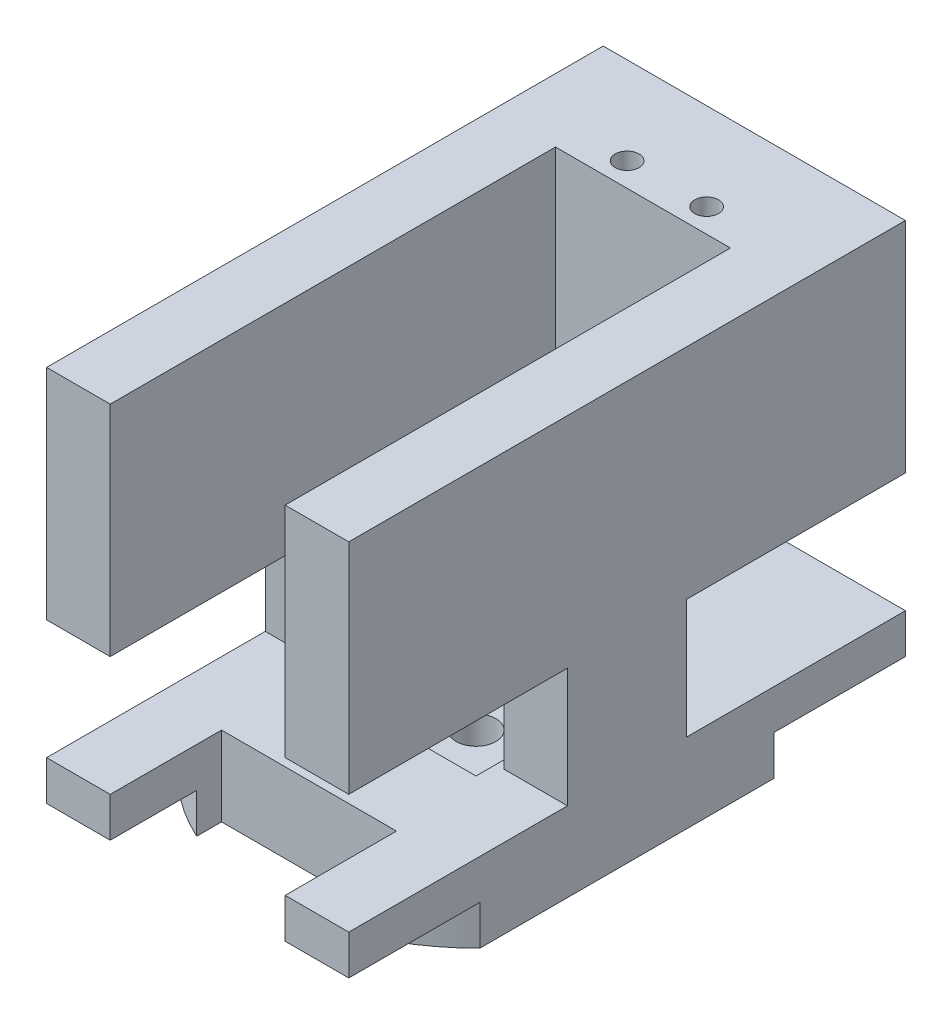
ISO-10303-21;
HEADER;
FILE_DESCRIPTION(('STEP AP214'),'2;1');
FILE_NAME('part.step','',(''),(''),'','','');
FILE_SCHEMA(('AUTOMOTIVE_DESIGN { 1 0 10303 214 1 1 1 1 }'));
ENDSEC;
DATA;
#1=APPLICATION_CONTEXT('core data for automotive mechanical design processes');
#2=APPLICATION_PROTOCOL_DEFINITION('international standard','automotive_design',2000,#1);
#3=PRODUCT_CONTEXT('',#1,'mechanical');
#4=PRODUCT('Part','Part','',(#3));
#5=PRODUCT_RELATED_PRODUCT_CATEGORY('part','',(#4));
#6=PRODUCT_DEFINITION_FORMATION('','',#4);
#7=PRODUCT_DEFINITION_CONTEXT('part definition',#1,'design');
#8=PRODUCT_DEFINITION('design','',#6,#7);
#9=PRODUCT_DEFINITION_SHAPE('','',#8);
#10=(LENGTH_UNIT() NAMED_UNIT(*) SI_UNIT(.MILLI.,.METRE.));
#11=(NAMED_UNIT(*) PLANE_ANGLE_UNIT() SI_UNIT($,.RADIAN.));
#12=(NAMED_UNIT(*) SI_UNIT($,.STERADIAN.) SOLID_ANGLE_UNIT());
#13=UNCERTAINTY_MEASURE_WITH_UNIT(LENGTH_MEASURE(1.E-05),#10,'distance_accuracy_value','');
#14=(GEOMETRIC_REPRESENTATION_CONTEXT(3) GLOBAL_UNCERTAINTY_ASSIGNED_CONTEXT((#13)) GLOBAL_UNIT_ASSIGNED_CONTEXT((#10,
#11,#12)) REPRESENTATION_CONTEXT('',''));
#15=CARTESIAN_POINT('',(0.,0.,0.));
#16=DIRECTION('',(0.,0.,1.));
#17=DIRECTION('',(1.,0.,0.));
#18=AXIS2_PLACEMENT_3D('',#15,#16,#17);
#19=CARTESIAN_POINT('',(0.,-20.,0.));
#20=DIRECTION('',(0.,-1.,0.));
#21=DIRECTION('',(0.,0.,-1.));
#22=AXIS2_PLACEMENT_3D('',#19,#20,#21);
#23=PLANE('',#22);
#24=DIRECTION('',(0.,0.,1.));
#25=VECTOR('',#24,1.);
#26=CARTESIAN_POINT('',(-19.,-20.,0.));
#27=LINE('',#26,#25);
#28=CARTESIAN_POINT('',(-19.,-20.,-35.));
#29=VERTEX_POINT('',#28);
#30=CARTESIAN_POINT('',(-19.,-20.,-18.4935392765032));
#31=VERTEX_POINT('',#30);
#32=EDGE_CURVE('E435',#29,#31,#27,.T.);
#33=ORIENTED_EDGE('',*,*,#32,.F.);
#34=DIRECTION('',(1.,0.,0.));
#35=VECTOR('',#34,1.);
#36=CARTESIAN_POINT('',(-45.,-20.,-35.));
#37=LINE('',#36,#35);
#38=CARTESIAN_POINT('',(19.,-20.,-35.));
#39=VERTEX_POINT('',#38);
#40=EDGE_CURVE('E536',#29,#39,#37,.T.);
#41=ORIENTED_EDGE('',*,*,#40,.T.);
#42=DIRECTION('',(0.,0.,-1.));
#43=VECTOR('',#42,1.);
#44=CARTESIAN_POINT('',(19.,-20.,0.));
#45=LINE('',#44,#43);
#46=CARTESIAN_POINT('',(19.,-20.,-18.4935392765033));
#47=VERTEX_POINT('',#46);
#48=EDGE_CURVE('E415',#47,#39,#45,.T.);
#49=ORIENTED_EDGE('',*,*,#48,.F.);
#50=CARTESIAN_POINT('',(0.,-20.,0.));
#51=DIRECTION('',(0.,-1.,0.));
#52=DIRECTION('',(0.,0.,-1.));
#53=AXIS2_PLACEMENT_3D('',#50,#51,#52);
#54=CIRCLE('',#53,26.5143545079183);
#55=EDGE_CURVE('E501',#31,#47,#54,.T.);
#56=ORIENTED_EDGE('',*,*,#55,.F.);
#57=EDGE_LOOP('',(#33,#41,#49,#56));
#58=FACE_BOUND('',#57,.T.);
#59=ADVANCED_FACE('F139',(#58),#23,.T.);
#60=CARTESIAN_POINT('',(19.,-20.,35.));
#61=VERTEX_POINT('',#60);
#62=CARTESIAN_POINT('',(19.,-20.,18.4935392765032));
#63=VERTEX_POINT('',#62);
#64=EDGE_CURVE('E417',#61,#63,#45,.T.);
#65=ORIENTED_EDGE('',*,*,#64,.F.);
#66=DIRECTION('',(-1.,0.,0.));
#67=VECTOR('',#66,1.);
#68=CARTESIAN_POINT('',(-45.,-20.,35.));
#69=LINE('',#68,#67);
#70=CARTESIAN_POINT('',(11.,-20.,35.));
#71=VERTEX_POINT('',#70);
#72=EDGE_CURVE('E541',#61,#71,#69,.T.);
#73=ORIENTED_EDGE('',*,*,#72,.T.);
#74=DIRECTION('',(0.,0.,1.));
#75=VECTOR('',#74,1.);
#76=CARTESIAN_POINT('',(11.,-20.,0.));
#77=LINE('',#76,#75);
#78=CARTESIAN_POINT('',(11.,-20.,24.1249040406707));
#79=VERTEX_POINT('',#78);
#80=EDGE_CURVE('E463',#79,#71,#77,.T.);
#81=ORIENTED_EDGE('',*,*,#80,.F.);
#82=EDGE_CURVE('E489',#63,#79,#54,.T.);
#83=ORIENTED_EDGE('',*,*,#82,.F.);
#84=EDGE_LOOP('',(#65,#73,#81,#83));
#85=FACE_BOUND('',#84,.T.);
#86=ADVANCED_FACE('F716',(#85),#23,.T.);
#87=CARTESIAN_POINT('',(0.,-25.,0.));
#88=DIRECTION('',(0.,1.,0.));
#89=DIRECTION('',(0.,0.,1.));
#90=AXIS2_PLACEMENT_3D('',#87,#88,#89);
#91=CYLINDRICAL_SURFACE('',#90,26.5143545079183);
#92=CARTESIAN_POINT('',(0.,-25.,0.));
#93=DIRECTION('',(0.,-1.,0.));
#94=DIRECTION('',(0.,0.,-1.));
#95=AXIS2_PLACEMENT_3D('',#92,#93,#94);
#96=CIRCLE('',#95,26.5143545079183);
#97=CARTESIAN_POINT('',(-19.,-25.,-18.4935392765032));
#98=VERTEX_POINT('',#97);
#99=CARTESIAN_POINT('',(19.,-25.,-18.4935392765033));
#100=VERTEX_POINT('',#99);
#101=EDGE_CURVE('E496',#98,#100,#96,.T.);
#102=ORIENTED_EDGE('',*,*,#101,.F.);
#103=DIRECTION('',(0.,1.,0.));
#104=VECTOR('',#103,1.);
#105=CARTESIAN_POINT('',(-19.,-25.,-18.4935392765032));
#106=LINE('',#105,#104);
#107=EDGE_CURVE('E12',#98,#31,#106,.T.);
#108=ORIENTED_EDGE('',*,*,#107,.T.);
#109=ORIENTED_EDGE('',*,*,#55,.T.);
#110=DIRECTION('',(0.,1.,0.));
#111=VECTOR('',#110,1.);
#112=CARTESIAN_POINT('',(19.,-25.,-18.4935392765033));
#113=LINE('',#112,#111);
#114=EDGE_CURVE('E604',#47,#100,#113,.F.);
#115=ORIENTED_EDGE('',*,*,#114,.T.);
#116=EDGE_LOOP('',(#102,#108,#109,#115));
#117=FACE_BOUND('',#116,.T.);
#118=ADVANCED_FACE('F704',(#117),#91,.T.);
#119=CARTESIAN_POINT('',(19.,-25.,18.4935392765032));
#120=VERTEX_POINT('',#119);
#121=CARTESIAN_POINT('',(11.,-25.,24.1249040406707));
#122=VERTEX_POINT('',#121);
#123=EDGE_CURVE('E497',#120,#122,#96,.T.);
#124=ORIENTED_EDGE('',*,*,#123,.F.);
#125=DIRECTION('',(0.,1.,0.));
#126=VECTOR('',#125,1.);
#127=CARTESIAN_POINT('',(19.,-25.,18.4935392765032));
#128=LINE('',#127,#126);
#129=EDGE_CURVE('E606',#120,#63,#128,.T.);
#130=ORIENTED_EDGE('',*,*,#129,.T.);
#131=ORIENTED_EDGE('',*,*,#82,.T.);
#132=DIRECTION('',(0.,1.,0.));
#133=VECTOR('',#132,1.);
#134=CARTESIAN_POINT('',(11.,-25.,24.1249040406707));
#135=LINE('',#134,#133);
#136=EDGE_CURVE('E598',#79,#122,#135,.F.);
#137=ORIENTED_EDGE('',*,*,#136,.T.);
#138=EDGE_LOOP('',(#124,#130,#131,#137));
#139=FACE_BOUND('',#138,.T.);
#140=ADVANCED_FACE('F712',(#139),#91,.T.);
#141=CARTESIAN_POINT('',(-45.,12.5,35.));
#142=DIRECTION('',(0.,0.,-1.));
#143=DIRECTION('',(-1.,0.,0.));
#144=AXIS2_PLACEMENT_3D('',#141,#142,#143);
#145=PLANE('',#144);
#146=DIRECTION('',(0.,1.,0.));
#147=VECTOR('',#146,1.);
#148=CARTESIAN_POINT('',(-11.,-25.,35.));
#149=LINE('',#148,#147);
#150=CARTESIAN_POINT('',(-11.,0.,35.));
#151=VERTEX_POINT('',#150);
#152=CARTESIAN_POINT('',(-11.,27.5,35.));
#153=VERTEX_POINT('',#152);
#154=EDGE_CURVE('E459',#151,#153,#149,.T.);
#155=ORIENTED_EDGE('',*,*,#154,.T.);
#156=DIRECTION('',(1.,0.,0.));
#157=VECTOR('',#156,1.);
#158=CARTESIAN_POINT('',(0.,27.5,35.));
#159=LINE('',#158,#157);
#160=CARTESIAN_POINT('',(-19.,27.5,35.));
#161=VERTEX_POINT('',#160);
#162=EDGE_CURVE('E379',#161,#153,#159,.T.);
#163=ORIENTED_EDGE('',*,*,#162,.F.);
#164=DIRECTION('',(0.,1.,0.));
#165=VECTOR('',#164,1.);
#166=CARTESIAN_POINT('',(-19.,-25.,35.));
#167=LINE('',#166,#165);
#168=CARTESIAN_POINT('',(-19.,0.,35.));
#169=VERTEX_POINT('',#168);
#170=EDGE_CURVE('E375',#169,#161,#167,.T.);
#171=ORIENTED_EDGE('',*,*,#170,.F.);
#172=DIRECTION('',(1.,0.,0.));
#173=VECTOR('',#172,1.);
#174=CARTESIAN_POINT('',(-45.,0.,35.));
#175=LINE('',#174,#173);
#176=EDGE_CURVE('E591',#169,#151,#175,.T.);
#177=ORIENTED_EDGE('',*,*,#176,.T.);
#178=EDGE_LOOP('',(#155,#163,#171,#177));
#179=FACE_BOUND('',#178,.T.);
#180=ADVANCED_FACE('F652',(#179),#145,.F.);
#181=CARTESIAN_POINT('',(0.,0.,0.));
#182=DIRECTION('',(0.,1.,0.));
#183=DIRECTION('',(0.,0.,1.));
#184=AXIS2_PLACEMENT_3D('',#181,#182,#183);
#185=PLANE('',#184);
#186=ORIENTED_EDGE('',*,*,#176,.F.);
#187=DIRECTION('',(0.,0.,-1.));
#188=VECTOR('',#187,1.);
#189=CARTESIAN_POINT('',(-19.,0.,0.));
#190=LINE('',#189,#188);
#191=CARTESIAN_POINT('',(-19.,0.,7.50000000000003));
#192=VERTEX_POINT('',#191);
#193=EDGE_CURVE('E442',#169,#192,#190,.T.);
#194=ORIENTED_EDGE('',*,*,#193,.T.);
#195=DIRECTION('',(1.,0.,0.));
#196=VECTOR('',#195,1.);
#197=CARTESIAN_POINT('',(0.,0.,7.50000000000003));
#198=LINE('',#197,#196);
#199=CARTESIAN_POINT('',(-11.,0.,7.50000000000003));
#200=VERTEX_POINT('',#199);
#201=EDGE_CURVE('E584',#192,#200,#198,.T.);
#202=ORIENTED_EDGE('',*,*,#201,.T.);
#203=DIRECTION('',(0.,0.,1.));
#204=VECTOR('',#203,1.);
#205=CARTESIAN_POINT('',(-11.,0.,0.));
#206=LINE('',#205,#204);
#207=EDGE_CURVE('E555',#200,#151,#206,.T.);
#208=ORIENTED_EDGE('',*,*,#207,.T.);
#209=EDGE_LOOP('',(#186,#194,#202,#208));
#210=FACE_BOUND('',#209,.T.);
#211=ADVANCED_FACE('F645',(#210),#185,.F.);
#212=CARTESIAN_POINT('',(-45.,-20.,35.));
#213=DIRECTION('',(0.,0.,-1.));
#214=DIRECTION('',(-1.,0.,0.));
#215=AXIS2_PLACEMENT_3D('',#212,#213,#214);
#216=PLANE('',#215);
#217=DIRECTION('',(-1.,0.,0.));
#218=VECTOR('',#217,1.);
#219=CARTESIAN_POINT('',(-45.,-15.,35.));
#220=LINE('',#219,#218);
#221=CARTESIAN_POINT('',(-11.,-15.,35.));
#222=VERTEX_POINT('',#221);
#223=CARTESIAN_POINT('',(-19.,-15.,35.));
#224=VERTEX_POINT('',#223);
#225=EDGE_CURVE('E546',#222,#224,#220,.T.);
#226=ORIENTED_EDGE('',*,*,#225,.T.);
#227=CARTESIAN_POINT('',(-19.,-20.,35.));
#228=VERTEX_POINT('',#227);
#229=EDGE_CURVE('E369',#228,#224,#167,.T.);
#230=ORIENTED_EDGE('',*,*,#229,.F.);
#231=CARTESIAN_POINT('',(-11.,-20.,35.));
#232=VERTEX_POINT('',#231);
#233=EDGE_CURVE('E539',#232,#228,#69,.T.);
#234=ORIENTED_EDGE('',*,*,#233,.F.);
#235=EDGE_CURVE('E470',#232,#222,#149,.T.);
#236=ORIENTED_EDGE('',*,*,#235,.T.);
#237=EDGE_LOOP('',(#226,#230,#234,#236));
#238=FACE_BOUND('',#237,.T.);
#239=ADVANCED_FACE('F630',(#238),#216,.F.);
#240=CARTESIAN_POINT('',(0.,-15.,-7.49999999999997));
#241=DIRECTION('',(0.,0.,1.));
#242=DIRECTION('',(1.,0.,0.));
#243=AXIS2_PLACEMENT_3D('',#240,#241,#242);
#244=PLANE('',#243);
#245=DIRECTION('',(1.,0.,0.));
#246=VECTOR('',#245,1.);
#247=CARTESIAN_POINT('',(0.,0.,-7.49999999999997));
#248=LINE('',#247,#246);
#249=CARTESIAN_POINT('',(11.,0.,-7.49999999999997));
#250=VERTEX_POINT('',#249);
#251=CARTESIAN_POINT('',(19.,0.,-7.49999999999997));
#252=VERTEX_POINT('',#251);
#253=EDGE_CURVE('E586',#250,#252,#248,.T.);
#254=ORIENTED_EDGE('',*,*,#253,.T.);
#255=DIRECTION('',(0.,-1.,0.));
#256=VECTOR('',#255,1.);
#257=CARTESIAN_POINT('',(19.,-15.,-7.49999999999997));
#258=LINE('',#257,#256);
#259=CARTESIAN_POINT('',(19.,-15.,-7.49999999999997));
#260=VERTEX_POINT('',#259);
#261=EDGE_CURVE('E421',#252,#260,#258,.T.);
#262=ORIENTED_EDGE('',*,*,#261,.T.);
#263=DIRECTION('',(1.,0.,0.));
#264=VECTOR('',#263,1.);
#265=CARTESIAN_POINT('',(0.,-15.,-7.49999999999997));
#266=LINE('',#265,#264);
#267=CARTESIAN_POINT('',(11.,-15.,-7.49999999999997));
#268=VERTEX_POINT('',#267);
#269=EDGE_CURVE('E580',#268,#260,#266,.T.);
#270=ORIENTED_EDGE('',*,*,#269,.F.);
#271=DIRECTION('',(0.,1.,0.));
#272=VECTOR('',#271,1.);
#273=CARTESIAN_POINT('',(11.,-15.,-7.49999999999997));
#274=LINE('',#273,#272);
#275=EDGE_CURVE('E568',#268,#250,#274,.T.);
#276=ORIENTED_EDGE('',*,*,#275,.T.);
#277=EDGE_LOOP('',(#254,#262,#270,#276));
#278=FACE_BOUND('',#277,.T.);
#279=ADVANCED_FACE('F668',(#278),#244,.F.);
#280=CARTESIAN_POINT('',(0.,-15.,7.50000000000003));
#281=DIRECTION('',(0.,0.,1.));
#282=DIRECTION('',(1.,0.,0.));
#283=AXIS2_PLACEMENT_3D('',#280,#281,#282);
#284=PLANE('',#283);
#285=DIRECTION('',(0.,-1.,0.));
#286=VECTOR('',#285,1.);
#287=CARTESIAN_POINT('',(19.,-15.,7.50000000000003));
#288=LINE('',#287,#286);
#289=CARTESIAN_POINT('',(19.,0.,7.50000000000003));
#290=VERTEX_POINT('',#289);
#291=CARTESIAN_POINT('',(19.,-15.,7.50000000000003));
#292=VERTEX_POINT('',#291);
#293=EDGE_CURVE('E428',#290,#292,#288,.T.);
#294=ORIENTED_EDGE('',*,*,#293,.F.);
#295=CARTESIAN_POINT('',(11.,0.,7.50000000000003));
#296=VERTEX_POINT('',#295);
#297=EDGE_CURVE('E577',#296,#290,#198,.T.);
#298=ORIENTED_EDGE('',*,*,#297,.F.);
#299=DIRECTION('',(0.,1.,0.));
#300=VECTOR('',#299,1.);
#301=CARTESIAN_POINT('',(11.,-15.,7.50000000000003));
#302=LINE('',#301,#300);
#303=CARTESIAN_POINT('',(11.,-15.,7.50000000000003));
#304=VERTEX_POINT('',#303);
#305=EDGE_CURVE('E596',#304,#296,#302,.T.);
#306=ORIENTED_EDGE('',*,*,#305,.F.);
#307=DIRECTION('',(1.,0.,0.));
#308=VECTOR('',#307,1.);
#309=CARTESIAN_POINT('',(0.,-15.,7.50000000000003));
#310=LINE('',#309,#308);
#311=EDGE_CURVE('E581',#304,#292,#310,.T.);
#312=ORIENTED_EDGE('',*,*,#311,.T.);
#313=EDGE_LOOP('',(#294,#298,#306,#312));
#314=FACE_BOUND('',#313,.T.);
#315=ADVANCED_FACE('F677',(#314),#284,.T.);
#316=CARTESIAN_POINT('',(-5.,0.,-24.));
#317=DIRECTION('',(0.,1.,0.));
#318=DIRECTION('',(0.,0.,1.));
#319=AXIS2_PLACEMENT_3D('',#316,#317,#318);
#320=CIRCLE('',#319,1.5);
#321=CARTESIAN_POINT('',(-5.,0.,-22.5));
#322=VERTEX_POINT('',#321);
#323=EDGE_CURVE('E386',#322,#322,#320,.T.);
#324=ORIENTED_EDGE('',*,*,#323,.T.);
#325=EDGE_LOOP('',(#324));
#326=FACE_BOUND('',#325,.T.);
#327=CARTESIAN_POINT('',(5.,0.,-24.));
#328=DIRECTION('',(0.,1.,0.));
#329=DIRECTION('',(0.,0.,1.));
#330=AXIS2_PLACEMENT_3D('',#327,#328,#329);
#331=CIRCLE('',#330,1.5);
#332=CARTESIAN_POINT('',(5.,0.,-22.5));
#333=VERTEX_POINT('',#332);
#334=EDGE_CURVE('E389',#333,#333,#331,.T.);
#335=ORIENTED_EDGE('',*,*,#334,.T.);
#336=EDGE_LOOP('',(#335));
#337=FACE_BOUND('',#336,.T.);
#338=CARTESIAN_POINT('',(-19.,0.,-7.49999999999997));
#339=VERTEX_POINT('',#338);
#340=CARTESIAN_POINT('',(-11.,0.,-7.49999999999997));
#341=VERTEX_POINT('',#340);
#342=EDGE_CURVE('E587',#339,#341,#248,.T.);
#343=ORIENTED_EDGE('',*,*,#342,.F.);
#344=DIRECTION('',(0.,0.,-1.));
#345=VECTOR('',#344,1.);
#346=CARTESIAN_POINT('',(-19.,0.,0.));
#347=LINE('',#346,#345);
#348=CARTESIAN_POINT('',(-19.,0.,-35.));
#349=VERTEX_POINT('',#348);
#350=EDGE_CURVE('E448',#339,#349,#347,.T.);
#351=ORIENTED_EDGE('',*,*,#350,.T.);
#352=DIRECTION('',(-1.,0.,0.));
#353=VECTOR('',#352,1.);
#354=CARTESIAN_POINT('',(-45.,0.,-35.));
#355=LINE('',#354,#353);
#356=CARTESIAN_POINT('',(19.,0.,-35.));
#357=VERTEX_POINT('',#356);
#358=EDGE_CURVE('E366',#357,#349,#355,.T.);
#359=ORIENTED_EDGE('',*,*,#358,.F.);
#360=DIRECTION('',(0.,0.,1.));
#361=VECTOR('',#360,1.);
#362=CARTESIAN_POINT('',(19.,0.,0.));
#363=LINE('',#362,#361);
#364=EDGE_CURVE('E425',#357,#252,#363,.T.);
#365=ORIENTED_EDGE('',*,*,#364,.T.);
#366=ORIENTED_EDGE('',*,*,#253,.F.);
#367=DIRECTION('',(0.,0.,-1.));
#368=VECTOR('',#367,1.);
#369=CARTESIAN_POINT('',(11.,0.,0.));
#370=LINE('',#369,#368);
#371=CARTESIAN_POINT('',(11.,0.,-21.));
#372=VERTEX_POINT('',#371);
#373=EDGE_CURVE('E571',#250,#372,#370,.T.);
#374=ORIENTED_EDGE('',*,*,#373,.T.);
#375=DIRECTION('',(-1.,0.,0.));
#376=VECTOR('',#375,1.);
#377=CARTESIAN_POINT('',(0.,0.,-21.));
#378=LINE('',#377,#376);
#379=CARTESIAN_POINT('',(-11.,0.,-21.));
#380=VERTEX_POINT('',#379);
#381=EDGE_CURVE('E574',#372,#380,#378,.T.);
#382=ORIENTED_EDGE('',*,*,#381,.T.);
#383=DIRECTION('',(0.,0.,1.));
#384=VECTOR('',#383,1.);
#385=CARTESIAN_POINT('',(-11.,0.,0.));
#386=LINE('',#385,#384);
#387=EDGE_CURVE('E562',#380,#341,#386,.T.);
#388=ORIENTED_EDGE('',*,*,#387,.T.);
#389=EDGE_LOOP('',(#343,#351,#359,#365,#366,#374,#382,#388));
#390=FACE_BOUND('',#389,.T.);
#391=ADVANCED_FACE('F665',(#326,#337,#390),#185,.F.);
#392=CARTESIAN_POINT('',(-45.,12.5,-35.));
#393=DIRECTION('',(0.,0.,1.));
#394=DIRECTION('',(1.,0.,0.));
#395=AXIS2_PLACEMENT_3D('',#392,#393,#394);
#396=PLANE('',#395);
#397=ORIENTED_EDGE('',*,*,#358,.T.);
#398=DIRECTION('',(0.,1.,0.));
#399=VECTOR('',#398,1.);
#400=CARTESIAN_POINT('',(-19.,-25.,-35.));
#401=LINE('',#400,#399);
#402=CARTESIAN_POINT('',(-19.,27.5,-35.));
#403=VERTEX_POINT('',#402);
#404=EDGE_CURVE('E360',#349,#403,#401,.T.);
#405=ORIENTED_EDGE('',*,*,#404,.T.);
#406=DIRECTION('',(-1.,0.,0.));
#407=VECTOR('',#406,1.);
#408=CARTESIAN_POINT('',(0.,27.5,-35.));
#409=LINE('',#408,#407);
#410=CARTESIAN_POINT('',(19.,27.5,-35.));
#411=VERTEX_POINT('',#410);
#412=EDGE_CURVE('E364',#411,#403,#409,.T.);
#413=ORIENTED_EDGE('',*,*,#412,.F.);
#414=DIRECTION('',(0.,1.,0.));
#415=VECTOR('',#414,1.);
#416=CARTESIAN_POINT('',(19.,-25.,-35.));
#417=LINE('',#416,#415);
#418=EDGE_CURVE('E409',#357,#411,#417,.T.);
#419=ORIENTED_EDGE('',*,*,#418,.F.);
#420=EDGE_LOOP('',(#397,#405,#413,#419));
#421=FACE_BOUND('',#420,.T.);
#422=ADVANCED_FACE('F141',(#421),#396,.F.);
#423=CARTESIAN_POINT('',(11.,0.,35.));
#424=VERTEX_POINT('',#423);
#425=CARTESIAN_POINT('',(19.,0.,35.));
#426=VERTEX_POINT('',#425);
#427=EDGE_CURVE('E590',#424,#426,#175,.T.);
#428=ORIENTED_EDGE('',*,*,#427,.T.);
#429=DIRECTION('',(0.,1.,0.));
#430=VECTOR('',#429,1.);
#431=CARTESIAN_POINT('',(19.,-25.,35.));
#432=LINE('',#431,#430);
#433=CARTESIAN_POINT('',(19.,27.5,35.));
#434=VERTEX_POINT('',#433);
#435=EDGE_CURVE('E406',#426,#434,#432,.T.);
#436=ORIENTED_EDGE('',*,*,#435,.T.);
#437=DIRECTION('',(1.,0.,0.));
#438=VECTOR('',#437,1.);
#439=CARTESIAN_POINT('',(0.,27.5,35.));
#440=LINE('',#439,#438);
#441=CARTESIAN_POINT('',(11.,27.5,35.));
#442=VERTEX_POINT('',#441);
#443=EDGE_CURVE('E403',#442,#434,#440,.T.);
#444=ORIENTED_EDGE('',*,*,#443,.F.);
#445=DIRECTION('',(0.,1.,0.));
#446=VECTOR('',#445,1.);
#447=CARTESIAN_POINT('',(11.,-25.,35.));
#448=LINE('',#447,#446);
#449=EDGE_CURVE('E468',#424,#442,#448,.T.);
#450=ORIENTED_EDGE('',*,*,#449,.F.);
#451=EDGE_LOOP('',(#428,#436,#444,#450));
#452=FACE_BOUND('',#451,.T.);
#453=ADVANCED_FACE('F686',(#452),#145,.F.);
#454=ORIENTED_EDGE('',*,*,#297,.T.);
#455=DIRECTION('',(0.,0.,1.));
#456=VECTOR('',#455,1.);
#457=CARTESIAN_POINT('',(19.,0.,0.));
#458=LINE('',#457,#456);
#459=EDGE_CURVE('E430',#290,#426,#458,.T.);
#460=ORIENTED_EDGE('',*,*,#459,.T.);
#461=ORIENTED_EDGE('',*,*,#427,.F.);
#462=DIRECTION('',(0.,0.,-1.));
#463=VECTOR('',#462,1.);
#464=CARTESIAN_POINT('',(11.,0.,0.));
#465=LINE('',#464,#463);
#466=EDGE_CURVE('E565',#424,#296,#465,.T.);
#467=ORIENTED_EDGE('',*,*,#466,.T.);
#468=EDGE_LOOP('',(#454,#460,#461,#467));
#469=FACE_BOUND('',#468,.T.);
#470=ADVANCED_FACE('F680',(#469),#185,.F.);
#471=CARTESIAN_POINT('',(-19.,-15.,-7.49999999999997));
#472=VERTEX_POINT('',#471);
#473=CARTESIAN_POINT('',(-11.,-15.,-7.49999999999997));
#474=VERTEX_POINT('',#473);
#475=EDGE_CURVE('E582',#472,#474,#266,.T.);
#476=ORIENTED_EDGE('',*,*,#475,.F.);
#477=DIRECTION('',(0.,1.,0.));
#478=VECTOR('',#477,1.);
#479=CARTESIAN_POINT('',(-19.,-15.,-7.49999999999997));
#480=LINE('',#479,#478);
#481=EDGE_CURVE('E445',#472,#339,#480,.T.);
#482=ORIENTED_EDGE('',*,*,#481,.T.);
#483=ORIENTED_EDGE('',*,*,#342,.T.);
#484=DIRECTION('',(0.,-1.,0.));
#485=VECTOR('',#484,1.);
#486=CARTESIAN_POINT('',(-11.,-15.,-7.49999999999997));
#487=LINE('',#486,#485);
#488=EDGE_CURVE('E559',#341,#474,#487,.T.);
#489=ORIENTED_EDGE('',*,*,#488,.T.);
#490=EDGE_LOOP('',(#476,#482,#483,#489));
#491=FACE_BOUND('',#490,.T.);
#492=ADVANCED_FACE('F691',(#491),#244,.F.);
#493=DIRECTION('',(0.,1.,0.));
#494=VECTOR('',#493,1.);
#495=CARTESIAN_POINT('',(-19.,-15.,7.50000000000003));
#496=LINE('',#495,#494);
#497=CARTESIAN_POINT('',(-19.,-15.,7.50000000000003));
#498=VERTEX_POINT('',#497);
#499=EDGE_CURVE('E439',#498,#192,#496,.T.);
#500=ORIENTED_EDGE('',*,*,#499,.F.);
#501=CARTESIAN_POINT('',(-11.,-15.,7.50000000000003));
#502=VERTEX_POINT('',#501);
#503=EDGE_CURVE('E578',#498,#502,#310,.T.);
#504=ORIENTED_EDGE('',*,*,#503,.T.);
#505=DIRECTION('',(0.,-1.,0.));
#506=VECTOR('',#505,1.);
#507=CARTESIAN_POINT('',(-11.,-15.,7.50000000000003));
#508=LINE('',#507,#506);
#509=EDGE_CURVE('E593',#200,#502,#508,.T.);
#510=ORIENTED_EDGE('',*,*,#509,.F.);
#511=ORIENTED_EDGE('',*,*,#201,.F.);
#512=EDGE_LOOP('',(#500,#504,#510,#511));
#513=FACE_BOUND('',#512,.T.);
#514=ADVANCED_FACE('F640',(#513),#284,.T.);
#515=CARTESIAN_POINT('',(-11.,-15.,-21.));
#516=DIRECTION('',(0.,0.,-1.));
#517=DIRECTION('',(-1.,0.,0.));
#518=AXIS2_PLACEMENT_3D('',#515,#516,#517);
#519=PLANE('',#518);
#520=DIRECTION('',(0.,1.,0.));
#521=VECTOR('',#520,1.);
#522=CARTESIAN_POINT('',(11.,-15.,-21.));
#523=LINE('',#522,#521);
#524=CARTESIAN_POINT('',(11.,27.5,-21.));
#525=VERTEX_POINT('',#524);
#526=EDGE_CURVE('E552',#372,#525,#523,.T.);
#527=ORIENTED_EDGE('',*,*,#526,.T.);
#528=DIRECTION('',(1.,0.,0.));
#529=VECTOR('',#528,1.);
#530=CARTESIAN_POINT('',(0.,27.5,-21.));
#531=LINE('',#530,#529);
#532=CARTESIAN_POINT('',(-11.,27.5,-21.));
#533=VERTEX_POINT('',#532);
#534=EDGE_CURVE('E397',#533,#525,#531,.T.);
#535=ORIENTED_EDGE('',*,*,#534,.F.);
#536=DIRECTION('',(0.,1.,0.));
#537=VECTOR('',#536,1.);
#538=CARTESIAN_POINT('',(-11.,-15.,-21.));
#539=LINE('',#538,#537);
#540=EDGE_CURVE('E553',#380,#533,#539,.T.);
#541=ORIENTED_EDGE('',*,*,#540,.F.);
#542=ORIENTED_EDGE('',*,*,#381,.F.);
#543=EDGE_LOOP('',(#527,#535,#541,#542));
#544=FACE_BOUND('',#543,.T.);
#545=ADVANCED_FACE('F657',(#544),#519,.F.);
#546=CARTESIAN_POINT('',(11.,-15.,-21.));
#547=DIRECTION('',(1.,0.,0.));
#548=DIRECTION('',(0.,0.,-1.));
#549=AXIS2_PLACEMENT_3D('',#546,#547,#548);
#550=PLANE('',#549);
#551=ORIENTED_EDGE('',*,*,#275,.F.);
#552=DIRECTION('',(0.,0.,-1.));
#553=VECTOR('',#552,1.);
#554=CARTESIAN_POINT('',(11.,-15.,-21.));
#555=LINE('',#554,#553);
#556=EDGE_CURVE('E543',#304,#268,#555,.T.);
#557=ORIENTED_EDGE('',*,*,#556,.F.);
#558=ORIENTED_EDGE('',*,*,#305,.T.);
#559=ORIENTED_EDGE('',*,*,#466,.F.);
#560=ORIENTED_EDGE('',*,*,#449,.T.);
#561=DIRECTION('',(0.,0.,1.));
#562=VECTOR('',#561,1.);
#563=CARTESIAN_POINT('',(11.,27.5,0.));
#564=LINE('',#563,#562);
#565=EDGE_CURVE('E400',#525,#442,#564,.T.);
#566=ORIENTED_EDGE('',*,*,#565,.F.);
#567=ORIENTED_EDGE('',*,*,#526,.F.);
#568=ORIENTED_EDGE('',*,*,#373,.F.);
#569=EDGE_LOOP('',(#551,#557,#558,#559,#560,#566,#567,#568));
#570=FACE_BOUND('',#569,.T.);
#571=ADVANCED_FACE('F661',(#570),#550,.F.);
#572=CARTESIAN_POINT('',(-11.,-15.,-21.));
#573=DIRECTION('',(-1.,0.,0.));
#574=DIRECTION('',(0.,0.,1.));
#575=AXIS2_PLACEMENT_3D('',#572,#573,#574);
#576=PLANE('',#575);
#577=ORIENTED_EDGE('',*,*,#540,.T.);
#578=DIRECTION('',(0.,0.,-1.));
#579=VECTOR('',#578,1.);
#580=CARTESIAN_POINT('',(-11.,27.5,0.));
#581=LINE('',#580,#579);
#582=EDGE_CURVE('E394',#153,#533,#581,.T.);
#583=ORIENTED_EDGE('',*,*,#582,.F.);
#584=ORIENTED_EDGE('',*,*,#154,.F.);
#585=ORIENTED_EDGE('',*,*,#207,.F.);
#586=ORIENTED_EDGE('',*,*,#509,.T.);
#587=DIRECTION('',(0.,0.,1.));
#588=VECTOR('',#587,1.);
#589=CARTESIAN_POINT('',(-11.,-15.,-21.));
#590=LINE('',#589,#588);
#591=EDGE_CURVE('E549',#474,#502,#590,.T.);
#592=ORIENTED_EDGE('',*,*,#591,.F.);
#593=ORIENTED_EDGE('',*,*,#488,.F.);
#594=ORIENTED_EDGE('',*,*,#387,.F.);
#595=EDGE_LOOP('',(#577,#583,#584,#585,#586,#592,#593,#594));
#596=FACE_BOUND('',#595,.T.);
#597=ADVANCED_FACE('F648',(#596),#576,.F.);
#598=CARTESIAN_POINT('',(0.,-15.,0.));
#599=DIRECTION('',(0.,-1.,0.));
#600=DIRECTION('',(0.,0.,-1.));
#601=AXIS2_PLACEMENT_3D('',#598,#599,#600);
#602=PLANE('',#601);
#603=DIRECTION('',(0.,0.,1.));
#604=VECTOR('',#603,1.);
#605=CARTESIAN_POINT('',(10.,-15.,10.));
#606=LINE('',#605,#604);
#607=CARTESIAN_POINT('',(10.,-15.,-10.));
#608=VERTEX_POINT('',#607);
#609=CARTESIAN_POINT('',(10.,-15.,10.));
#610=VERTEX_POINT('',#609);
#611=EDGE_CURVE('E495',#608,#610,#606,.T.);
#612=ORIENTED_EDGE('',*,*,#611,.T.);
#613=DIRECTION('',(-1.,0.,0.));
#614=VECTOR('',#613,1.);
#615=CARTESIAN_POINT('',(-10.,-15.,10.));
#616=LINE('',#615,#614);
#617=CARTESIAN_POINT('',(-10.,-15.,10.));
#618=VERTEX_POINT('',#617);
#619=EDGE_CURVE('E518',#610,#618,#616,.T.);
#620=ORIENTED_EDGE('',*,*,#619,.T.);
#621=DIRECTION('',(0.,0.,-1.));
#622=VECTOR('',#621,1.);
#623=CARTESIAN_POINT('',(-10.,-15.,10.));
#624=LINE('',#623,#622);
#625=CARTESIAN_POINT('',(-10.,-15.,-10.));
#626=VERTEX_POINT('',#625);
#627=EDGE_CURVE('E521',#618,#626,#624,.T.);
#628=ORIENTED_EDGE('',*,*,#627,.T.);
#629=DIRECTION('',(1.,0.,0.));
#630=VECTOR('',#629,1.);
#631=CARTESIAN_POINT('',(-10.,-15.,-10.));
#632=LINE('',#631,#630);
#633=EDGE_CURVE('E506',#626,#608,#632,.T.);
#634=ORIENTED_EDGE('',*,*,#633,.T.);
#635=EDGE_LOOP('',(#612,#620,#628,#634));
#636=FACE_BOUND('',#635,.T.);
#637=DIRECTION('',(1.,0.,0.));
#638=VECTOR('',#637,1.);
#639=CARTESIAN_POINT('',(-45.,-15.,-35.));
#640=LINE('',#639,#638);
#641=CARTESIAN_POINT('',(-19.,-15.,-35.));
#642=VERTEX_POINT('',#641);
#643=CARTESIAN_POINT('',(19.,-15.,-35.));
#644=VERTEX_POINT('',#643);
#645=EDGE_CURVE('E535',#642,#644,#640,.T.);
#646=ORIENTED_EDGE('',*,*,#645,.F.);
#647=DIRECTION('',(0.,0.,1.));
#648=VECTOR('',#647,1.);
#649=CARTESIAN_POINT('',(-19.,-15.,0.));
#650=LINE('',#649,#648);
#651=EDGE_CURVE('E440',#642,#472,#650,.T.);
#652=ORIENTED_EDGE('',*,*,#651,.T.);
#653=ORIENTED_EDGE('',*,*,#475,.T.);
#654=ORIENTED_EDGE('',*,*,#591,.T.);
#655=ORIENTED_EDGE('',*,*,#503,.F.);
#656=EDGE_CURVE('E436',#498,#224,#650,.T.);
#657=ORIENTED_EDGE('',*,*,#656,.T.);
#658=ORIENTED_EDGE('',*,*,#225,.F.);
#659=DIRECTION('',(0.,0.,-1.));
#660=VECTOR('',#659,1.);
#661=CARTESIAN_POINT('',(-11.,-15.,0.));
#662=LINE('',#661,#660);
#663=CARTESIAN_POINT('',(-11.,-15.,21.));
#664=VERTEX_POINT('',#663);
#665=EDGE_CURVE('E479',#222,#664,#662,.T.);
#666=ORIENTED_EDGE('',*,*,#665,.T.);
#667=DIRECTION('',(1.,0.,0.));
#668=VECTOR('',#667,1.);
#669=CARTESIAN_POINT('',(0.,-15.,21.));
#670=LINE('',#669,#668);
#671=CARTESIAN_POINT('',(11.,-15.,21.));
#672=VERTEX_POINT('',#671);
#673=EDGE_CURVE('E482',#664,#672,#670,.T.);
#674=ORIENTED_EDGE('',*,*,#673,.T.);
#675=DIRECTION('',(0.,0.,1.));
#676=VECTOR('',#675,1.);
#677=CARTESIAN_POINT('',(11.,-15.,0.));
#678=LINE('',#677,#676);
#679=CARTESIAN_POINT('',(11.,-15.,35.));
#680=VERTEX_POINT('',#679);
#681=EDGE_CURVE('E474',#672,#680,#678,.T.);
#682=ORIENTED_EDGE('',*,*,#681,.T.);
#683=CARTESIAN_POINT('',(19.,-15.,35.));
#684=VERTEX_POINT('',#683);
#685=EDGE_CURVE('E540',#684,#680,#220,.T.);
#686=ORIENTED_EDGE('',*,*,#685,.F.);
#687=DIRECTION('',(0.,0.,-1.));
#688=VECTOR('',#687,1.);
#689=CARTESIAN_POINT('',(19.,-15.,0.));
#690=LINE('',#689,#688);
#691=EDGE_CURVE('E422',#684,#292,#690,.T.);
#692=ORIENTED_EDGE('',*,*,#691,.T.);
#693=ORIENTED_EDGE('',*,*,#311,.F.);
#694=ORIENTED_EDGE('',*,*,#556,.T.);
#695=ORIENTED_EDGE('',*,*,#269,.T.);
#696=EDGE_CURVE('E418',#260,#644,#690,.T.);
#697=ORIENTED_EDGE('',*,*,#696,.T.);
#698=EDGE_LOOP('',(#646,#652,#653,#654,#655,#657,#658,#666,#674,#682,#686,#692,#693,#694,#695,#697));
#699=FACE_BOUND('',#698,.T.);
#700=ADVANCED_FACE('F635',(#636,#699),#602,.F.);
#701=CARTESIAN_POINT('',(-19.,-20.,18.4935392765032));
#702=VERTEX_POINT('',#701);
#703=EDGE_CURVE('E433',#702,#228,#27,.T.);
#704=ORIENTED_EDGE('',*,*,#703,.F.);
#705=CARTESIAN_POINT('',(-11.,-20.,24.1249040406707));
#706=VERTEX_POINT('',#705);
#707=EDGE_CURVE('E498',#706,#702,#54,.T.);
#708=ORIENTED_EDGE('',*,*,#707,.F.);
#709=DIRECTION('',(0.,0.,-1.));
#710=VECTOR('',#709,1.);
#711=CARTESIAN_POINT('',(-11.,-20.,0.));
#712=LINE('',#711,#710);
#713=EDGE_CURVE('E477',#232,#706,#712,.T.);
#714=ORIENTED_EDGE('',*,*,#713,.F.);
#715=ORIENTED_EDGE('',*,*,#233,.T.);
#716=EDGE_LOOP('',(#704,#708,#714,#715));
#717=FACE_BOUND('',#716,.T.);
#718=ADVANCED_FACE('F624',(#717),#23,.T.);
#719=CARTESIAN_POINT('',(-45.,-20.,-35.));
#720=DIRECTION('',(0.,0.,1.));
#721=DIRECTION('',(1.,0.,0.));
#722=AXIS2_PLACEMENT_3D('',#719,#720,#721);
#723=PLANE('',#722);
#724=ORIENTED_EDGE('',*,*,#40,.F.);
#725=EDGE_CURVE('E368',#29,#642,#401,.T.);
#726=ORIENTED_EDGE('',*,*,#725,.T.);
#727=ORIENTED_EDGE('',*,*,#645,.T.);
#728=EDGE_CURVE('E411',#39,#644,#417,.T.);
#729=ORIENTED_EDGE('',*,*,#728,.F.);
#730=EDGE_LOOP('',(#724,#726,#727,#729));
#731=FACE_BOUND('',#730,.T.);
#732=ADVANCED_FACE('F697',(#731),#723,.F.);
#733=ORIENTED_EDGE('',*,*,#72,.F.);
#734=EDGE_CURVE('E412',#61,#684,#432,.T.);
#735=ORIENTED_EDGE('',*,*,#734,.T.);
#736=ORIENTED_EDGE('',*,*,#685,.T.);
#737=EDGE_CURVE('E467',#71,#680,#448,.T.);
#738=ORIENTED_EDGE('',*,*,#737,.F.);
#739=EDGE_LOOP('',(#733,#735,#736,#738));
#740=FACE_BOUND('',#739,.T.);
#741=ADVANCED_FACE('F721',(#740),#216,.F.);
#742=CARTESIAN_POINT('',(10.,-20.,10.));
#743=DIRECTION('',(-1.,0.,0.));
#744=DIRECTION('',(0.,0.,1.));
#745=AXIS2_PLACEMENT_3D('',#742,#743,#744);
#746=PLANE('',#745);
#747=ORIENTED_EDGE('',*,*,#611,.F.);
#748=DIRECTION('',(0.,1.,0.));
#749=VECTOR('',#748,1.);
#750=CARTESIAN_POINT('',(10.,-20.,-10.));
#751=LINE('',#750,#749);
#752=CARTESIAN_POINT('',(10.,-20.,-10.));
#753=VERTEX_POINT('',#752);
#754=EDGE_CURVE('E515',#753,#608,#751,.T.);
#755=ORIENTED_EDGE('',*,*,#754,.F.);
#756=DIRECTION('',(0.,0.,1.));
#757=VECTOR('',#756,1.);
#758=CARTESIAN_POINT('',(10.,-20.,10.));
#759=LINE('',#758,#757);
#760=CARTESIAN_POINT('',(10.,-20.,10.));
#761=VERTEX_POINT('',#760);
#762=EDGE_CURVE('E502',#753,#761,#759,.T.);
#763=ORIENTED_EDGE('',*,*,#762,.T.);
#764=DIRECTION('',(0.,1.,0.));
#765=VECTOR('',#764,1.);
#766=CARTESIAN_POINT('',(10.,-20.,10.));
#767=LINE('',#766,#765);
#768=EDGE_CURVE('E532',#761,#610,#767,.T.);
#769=ORIENTED_EDGE('',*,*,#768,.T.);
#770=EDGE_LOOP('',(#747,#755,#763,#769));
#771=FACE_BOUND('',#770,.T.);
#772=ADVANCED_FACE('F757',(#771),#746,.T.);
#773=CARTESIAN_POINT('',(-10.,-20.,10.));
#774=DIRECTION('',(0.,0.,-1.));
#775=DIRECTION('',(-1.,0.,0.));
#776=AXIS2_PLACEMENT_3D('',#773,#774,#775);
#777=PLANE('',#776);
#778=ORIENTED_EDGE('',*,*,#619,.F.);
#779=ORIENTED_EDGE('',*,*,#768,.F.);
#780=DIRECTION('',(-1.,0.,0.));
#781=VECTOR('',#780,1.);
#782=CARTESIAN_POINT('',(-10.,-20.,10.));
#783=LINE('',#782,#781);
#784=CARTESIAN_POINT('',(-10.,-20.,10.));
#785=VERTEX_POINT('',#784);
#786=EDGE_CURVE('E505',#761,#785,#783,.T.);
#787=ORIENTED_EDGE('',*,*,#786,.T.);
#788=DIRECTION('',(0.,1.,0.));
#789=VECTOR('',#788,1.);
#790=CARTESIAN_POINT('',(-10.,-20.,10.));
#791=LINE('',#790,#789);
#792=EDGE_CURVE('E530',#785,#618,#791,.T.);
#793=ORIENTED_EDGE('',*,*,#792,.T.);
#794=EDGE_LOOP('',(#778,#779,#787,#793));
#795=FACE_BOUND('',#794,.T.);
#796=ADVANCED_FACE('F1047',(#795),#777,.T.);
#797=CARTESIAN_POINT('',(-10.,-20.,10.));
#798=DIRECTION('',(1.,0.,0.));
#799=DIRECTION('',(0.,0.,-1.));
#800=AXIS2_PLACEMENT_3D('',#797,#798,#799);
#801=PLANE('',#800);
#802=ORIENTED_EDGE('',*,*,#627,.F.);
#803=ORIENTED_EDGE('',*,*,#792,.F.);
#804=DIRECTION('',(0.,0.,-1.));
#805=VECTOR('',#804,1.);
#806=CARTESIAN_POINT('',(-10.,-20.,10.));
#807=LINE('',#806,#805);
#808=CARTESIAN_POINT('',(-10.,-20.,-10.));
#809=VERTEX_POINT('',#808);
#810=EDGE_CURVE('E509',#785,#809,#807,.T.);
#811=ORIENTED_EDGE('',*,*,#810,.T.);
#812=DIRECTION('',(0.,1.,0.));
#813=VECTOR('',#812,1.);
#814=CARTESIAN_POINT('',(-10.,-20.,-10.));
#815=LINE('',#814,#813);
#816=EDGE_CURVE('E528',#809,#626,#815,.T.);
#817=ORIENTED_EDGE('',*,*,#816,.T.);
#818=EDGE_LOOP('',(#802,#803,#811,#817));
#819=FACE_BOUND('',#818,.T.);
#820=ADVANCED_FACE('F1055',(#819),#801,.T.);
#821=CARTESIAN_POINT('',(-10.,-20.,-10.));
#822=DIRECTION('',(0.,0.,1.));
#823=DIRECTION('',(1.,0.,0.));
#824=AXIS2_PLACEMENT_3D('',#821,#822,#823);
#825=PLANE('',#824);
#826=ORIENTED_EDGE('',*,*,#633,.F.);
#827=ORIENTED_EDGE('',*,*,#816,.F.);
#828=DIRECTION('',(1.,0.,0.));
#829=VECTOR('',#828,1.);
#830=CARTESIAN_POINT('',(-10.,-20.,-10.));
#831=LINE('',#830,#829);
#832=EDGE_CURVE('E512',#809,#753,#831,.T.);
#833=ORIENTED_EDGE('',*,*,#832,.T.);
#834=ORIENTED_EDGE('',*,*,#754,.T.);
#835=EDGE_LOOP('',(#826,#827,#833,#834));
#836=FACE_BOUND('',#835,.T.);
#837=ADVANCED_FACE('F796',(#836),#825,.T.);
#838=CARTESIAN_POINT('',(0.,-25.,0.));
#839=DIRECTION('',(0.,-1.,0.));
#840=DIRECTION('',(0.,0.,-1.));
#841=AXIS2_PLACEMENT_3D('',#838,#839,#840);
#842=PLANE('',#841);
#843=DIRECTION('',(0.,0.,-1.));
#844=VECTOR('',#843,1.);
#845=CARTESIAN_POINT('',(-19.,-25.,-35.));
#846=LINE('',#845,#844);
#847=CARTESIAN_POINT('',(-19.,-25.,18.4935392765032));
#848=VERTEX_POINT('',#847);
#849=EDGE_CURVE('E162',#848,#98,#846,.T.);
#850=ORIENTED_EDGE('',*,*,#849,.T.);
#851=ORIENTED_EDGE('',*,*,#101,.T.);
#852=DIRECTION('',(0.,0.,1.));
#853=VECTOR('',#852,1.);
#854=CARTESIAN_POINT('',(19.,-25.,-35.));
#855=LINE('',#854,#853);
#856=EDGE_CURVE('E154',#100,#120,#855,.T.);
#857=ORIENTED_EDGE('',*,*,#856,.T.);
#858=ORIENTED_EDGE('',*,*,#123,.T.);
#859=DIRECTION('',(0.,0.,-1.));
#860=VECTOR('',#859,1.);
#861=CARTESIAN_POINT('',(11.,-25.,21.));
#862=LINE('',#861,#860);
#863=CARTESIAN_POINT('',(11.,-25.,21.));
#864=VERTEX_POINT('',#863);
#865=EDGE_CURVE('E453',#122,#864,#862,.T.);
#866=ORIENTED_EDGE('',*,*,#865,.T.);
#867=DIRECTION('',(-1.,0.,0.));
#868=VECTOR('',#867,1.);
#869=CARTESIAN_POINT('',(-11.,-25.,21.));
#870=LINE('',#869,#868);
#871=CARTESIAN_POINT('',(-11.,-25.,21.));
#872=VERTEX_POINT('',#871);
#873=EDGE_CURVE('E456',#864,#872,#870,.T.);
#874=ORIENTED_EDGE('',*,*,#873,.T.);
#875=DIRECTION('',(0.,0.,1.));
#876=VECTOR('',#875,1.);
#877=CARTESIAN_POINT('',(-11.,-25.,21.));
#878=LINE('',#877,#876);
#879=CARTESIAN_POINT('',(-11.,-25.,24.1249040406707));
#880=VERTEX_POINT('',#879);
#881=EDGE_CURVE('E450',#872,#880,#878,.T.);
#882=ORIENTED_EDGE('',*,*,#881,.T.);
#883=EDGE_CURVE('E492',#880,#848,#96,.T.);
#884=ORIENTED_EDGE('',*,*,#883,.T.);
#885=EDGE_LOOP('',(#850,#851,#857,#858,#866,#874,#882,#884));
#886=FACE_BOUND('',#885,.T.);
#887=CARTESIAN_POINT('',(0.,-25.,0.));
#888=DIRECTION('',(0.,-1.,0.));
#889=DIRECTION('',(0.,0.,-1.));
#890=AXIS2_PLACEMENT_3D('',#887,#888,#889);
#891=CIRCLE('',#890,2.5);
#892=CARTESIAN_POINT('',(0.,-25.,-2.5));
#893=VERTEX_POINT('',#892);
#894=EDGE_CURVE('E486',#893,#893,#891,.T.);
#895=ORIENTED_EDGE('',*,*,#894,.F.);
#896=EDGE_LOOP('',(#895));
#897=FACE_BOUND('',#896,.T.);
#898=ADVANCED_FACE('F614',(#886,#897),#842,.T.);
#899=CARTESIAN_POINT('',(0.,-20.,0.));
#900=DIRECTION('',(0.,-1.,0.));
#901=DIRECTION('',(0.,0.,-1.));
#902=AXIS2_PLACEMENT_3D('',#899,#900,#901);
#903=PLANE('',#902);
#904=ORIENTED_EDGE('',*,*,#762,.F.);
#905=ORIENTED_EDGE('',*,*,#832,.F.);
#906=ORIENTED_EDGE('',*,*,#810,.F.);
#907=ORIENTED_EDGE('',*,*,#786,.F.);
#908=EDGE_LOOP('',(#904,#905,#906,#907));
#909=FACE_BOUND('',#908,.T.);
#910=CARTESIAN_POINT('',(0.,-20.,0.));
#911=DIRECTION('',(0.,-1.,0.));
#912=DIRECTION('',(0.,0.,-1.));
#913=AXIS2_PLACEMENT_3D('',#910,#911,#912);
#914=CIRCLE('',#913,2.5);
#915=CARTESIAN_POINT('',(0.,-20.,-2.5));
#916=VERTEX_POINT('',#915);
#917=EDGE_CURVE('E485',#916,#916,#914,.T.);
#918=ORIENTED_EDGE('',*,*,#917,.T.);
#919=EDGE_LOOP('',(#918));
#920=FACE_BOUND('',#919,.T.);
#921=ADVANCED_FACE('F784',(#909,#920),#903,.F.);
#922=ORIENTED_EDGE('',*,*,#707,.T.);
#923=DIRECTION('',(0.,1.,0.));
#924=VECTOR('',#923,1.);
#925=CARTESIAN_POINT('',(-19.,-25.,18.4935392765032));
#926=LINE('',#925,#924);
#927=EDGE_CURVE('E147',#702,#848,#926,.F.);
#928=ORIENTED_EDGE('',*,*,#927,.T.);
#929=ORIENTED_EDGE('',*,*,#883,.F.);
#930=DIRECTION('',(0.,1.,0.));
#931=VECTOR('',#930,1.);
#932=CARTESIAN_POINT('',(-11.,-25.,24.1249040406707));
#933=LINE('',#932,#931);
#934=EDGE_CURVE('E601',#880,#706,#933,.T.);
#935=ORIENTED_EDGE('',*,*,#934,.T.);
#936=EDGE_LOOP('',(#922,#928,#929,#935));
#937=FACE_BOUND('',#936,.T.);
#938=ADVANCED_FACE('F610',(#937),#91,.T.);
#939=CARTESIAN_POINT('',(0.,-25.,0.));
#940=DIRECTION('',(0.,1.,0.));
#941=DIRECTION('',(0.,0.,1.));
#942=AXIS2_PLACEMENT_3D('',#939,#940,#941);
#943=CYLINDRICAL_SURFACE('',#942,2.5);
#944=ORIENTED_EDGE('',*,*,#894,.T.);
#945=EDGE_LOOP('',(#944));
#946=FACE_BOUND('',#945,.T.);
#947=ORIENTED_EDGE('',*,*,#917,.F.);
#948=EDGE_LOOP('',(#947));
#949=FACE_BOUND('',#948,.T.);
#950=ADVANCED_FACE('F783',(#946,#949),#943,.F.);
#951=CARTESIAN_POINT('',(11.,-25.,21.));
#952=DIRECTION('',(1.,0.,0.));
#953=DIRECTION('',(0.,0.,-1.));
#954=AXIS2_PLACEMENT_3D('',#951,#952,#953);
#955=PLANE('',#954);
#956=DIRECTION('',(0.,1.,0.));
#957=VECTOR('',#956,1.);
#958=CARTESIAN_POINT('',(11.,-25.,21.));
#959=LINE('',#958,#957);
#960=EDGE_CURVE('E464',#864,#672,#959,.T.);
#961=ORIENTED_EDGE('',*,*,#960,.F.);
#962=ORIENTED_EDGE('',*,*,#865,.F.);
#963=ORIENTED_EDGE('',*,*,#136,.F.);
#964=ORIENTED_EDGE('',*,*,#80,.T.);
#965=ORIENTED_EDGE('',*,*,#737,.T.);
#966=ORIENTED_EDGE('',*,*,#681,.F.);
#967=EDGE_LOOP('',(#961,#962,#963,#964,#965,#966));
#968=FACE_BOUND('',#967,.T.);
#969=ADVANCED_FACE('F710',(#968),#955,.F.);
#970=CARTESIAN_POINT('',(-11.,-25.,21.));
#971=DIRECTION('',(-1.,0.,0.));
#972=DIRECTION('',(0.,0.,1.));
#973=AXIS2_PLACEMENT_3D('',#970,#971,#972);
#974=PLANE('',#973);
#975=ORIENTED_EDGE('',*,*,#235,.F.);
#976=ORIENTED_EDGE('',*,*,#713,.T.);
#977=ORIENTED_EDGE('',*,*,#934,.F.);
#978=ORIENTED_EDGE('',*,*,#881,.F.);
#979=DIRECTION('',(0.,1.,0.));
#980=VECTOR('',#979,1.);
#981=CARTESIAN_POINT('',(-11.,-25.,21.));
#982=LINE('',#981,#980);
#983=EDGE_CURVE('E460',#872,#664,#982,.T.);
#984=ORIENTED_EDGE('',*,*,#983,.T.);
#985=ORIENTED_EDGE('',*,*,#665,.F.);
#986=EDGE_LOOP('',(#975,#976,#977,#978,#984,#985));
#987=FACE_BOUND('',#986,.T.);
#988=ADVANCED_FACE('F621',(#987),#974,.F.);
#989=CARTESIAN_POINT('',(-11.,-25.,21.));
#990=DIRECTION('',(0.,0.,-1.));
#991=DIRECTION('',(-1.,0.,0.));
#992=AXIS2_PLACEMENT_3D('',#989,#990,#991);
#993=PLANE('',#992);
#994=ORIENTED_EDGE('',*,*,#983,.F.);
#995=ORIENTED_EDGE('',*,*,#873,.F.);
#996=ORIENTED_EDGE('',*,*,#960,.T.);
#997=ORIENTED_EDGE('',*,*,#673,.F.);
#998=EDGE_LOOP('',(#994,#995,#996,#997));
#999=FACE_BOUND('',#998,.T.);
#1000=ADVANCED_FACE('F726',(#999),#993,.F.);
#1001=CARTESIAN_POINT('',(19.,-25.,-35.));
#1002=DIRECTION('',(-1.,0.,0.));
#1003=DIRECTION('',(0.,0.,1.));
#1004=AXIS2_PLACEMENT_3D('',#1001,#1002,#1003);
#1005=PLANE('',#1004);
#1006=ORIENTED_EDGE('',*,*,#293,.T.);
#1007=ORIENTED_EDGE('',*,*,#691,.F.);
#1008=ORIENTED_EDGE('',*,*,#734,.F.);
#1009=ORIENTED_EDGE('',*,*,#64,.T.);
#1010=ORIENTED_EDGE('',*,*,#129,.F.);
#1011=ORIENTED_EDGE('',*,*,#856,.F.);
#1012=ORIENTED_EDGE('',*,*,#114,.F.);
#1013=ORIENTED_EDGE('',*,*,#48,.T.);
#1014=ORIENTED_EDGE('',*,*,#728,.T.);
#1015=ORIENTED_EDGE('',*,*,#696,.F.);
#1016=ORIENTED_EDGE('',*,*,#261,.F.);
#1017=ORIENTED_EDGE('',*,*,#364,.F.);
#1018=ORIENTED_EDGE('',*,*,#418,.T.);
#1019=DIRECTION('',(0.,0.,-1.));
#1020=VECTOR('',#1019,1.);
#1021=CARTESIAN_POINT('',(19.,27.5,0.));
#1022=LINE('',#1021,#1020);
#1023=EDGE_CURVE('E385',#434,#411,#1022,.T.);
#1024=ORIENTED_EDGE('',*,*,#1023,.F.);
#1025=ORIENTED_EDGE('',*,*,#435,.F.);
#1026=ORIENTED_EDGE('',*,*,#459,.F.);
#1027=EDGE_LOOP('',(#1006,#1007,#1008,#1009,#1010,#1011,#1012,#1013,#1014,#1015,#1016,#1017,
#1018,#1024,#1025,#1026));
#1028=FACE_BOUND('',#1027,.T.);
#1029=ADVANCED_FACE('F687',(#1028),#1005,.F.);
#1030=CARTESIAN_POINT('',(-19.,-25.,-35.));
#1031=DIRECTION('',(1.,0.,0.));
#1032=DIRECTION('',(0.,0.,-1.));
#1033=AXIS2_PLACEMENT_3D('',#1030,#1031,#1032);
#1034=PLANE('',#1033);
#1035=ORIENTED_EDGE('',*,*,#481,.F.);
#1036=ORIENTED_EDGE('',*,*,#651,.F.);
#1037=ORIENTED_EDGE('',*,*,#725,.F.);
#1038=ORIENTED_EDGE('',*,*,#32,.T.);
#1039=ORIENTED_EDGE('',*,*,#107,.F.);
#1040=ORIENTED_EDGE('',*,*,#849,.F.);
#1041=ORIENTED_EDGE('',*,*,#927,.F.);
#1042=ORIENTED_EDGE('',*,*,#703,.T.);
#1043=ORIENTED_EDGE('',*,*,#229,.T.);
#1044=ORIENTED_EDGE('',*,*,#656,.F.);
#1045=ORIENTED_EDGE('',*,*,#499,.T.);
#1046=ORIENTED_EDGE('',*,*,#193,.F.);
#1047=ORIENTED_EDGE('',*,*,#170,.T.);
#1048=DIRECTION('',(0.,0.,1.));
#1049=VECTOR('',#1048,1.);
#1050=CARTESIAN_POINT('',(-19.,27.5,0.));
#1051=LINE('',#1050,#1049);
#1052=EDGE_CURVE('E372',#403,#161,#1051,.T.);
#1053=ORIENTED_EDGE('',*,*,#1052,.F.);
#1054=ORIENTED_EDGE('',*,*,#404,.F.);
#1055=ORIENTED_EDGE('',*,*,#350,.F.);
#1056=EDGE_LOOP('',(#1035,#1036,#1037,#1038,#1039,#1040,#1041,#1042,#1043,#1044,#1045,#1046,
#1047,#1053,#1054,#1055));
#1057=FACE_BOUND('',#1056,.T.);
#1058=ADVANCED_FACE('F373',(#1057),#1034,.F.);
#1059=CARTESIAN_POINT('',(0.,27.5,0.));
#1060=DIRECTION('',(0.,1.,0.));
#1061=DIRECTION('',(0.,0.,1.));
#1062=AXIS2_PLACEMENT_3D('',#1059,#1060,#1061);
#1063=PLANE('',#1062);
#1064=CARTESIAN_POINT('',(-5.,27.5,-24.));
#1065=DIRECTION('',(0.,1.,0.));
#1066=DIRECTION('',(0.,0.,1.));
#1067=AXIS2_PLACEMENT_3D('',#1064,#1065,#1066);
#1068=CIRCLE('',#1067,1.5);
#1069=CARTESIAN_POINT('',(-5.,27.5,-22.5));
#1070=VERTEX_POINT('',#1069);
#1071=EDGE_CURVE('E971',#1070,#1070,#1068,.T.);
#1072=ORIENTED_EDGE('',*,*,#1071,.F.);
#1073=EDGE_LOOP('',(#1072));
#1074=FACE_BOUND('',#1073,.T.);
#1075=CARTESIAN_POINT('',(5.,27.5,-24.));
#1076=DIRECTION('',(0.,1.,0.));
#1077=DIRECTION('',(0.,0.,1.));
#1078=AXIS2_PLACEMENT_3D('',#1075,#1076,#1077);
#1079=CIRCLE('',#1078,1.5);
#1080=CARTESIAN_POINT('',(5.,27.5,-22.5));
#1081=VERTEX_POINT('',#1080);
#1082=EDGE_CURVE('E977',#1081,#1081,#1079,.T.);
#1083=ORIENTED_EDGE('',*,*,#1082,.F.);
#1084=EDGE_LOOP('',(#1083));
#1085=FACE_BOUND('',#1084,.T.);
#1086=ORIENTED_EDGE('',*,*,#412,.T.);
#1087=ORIENTED_EDGE('',*,*,#1052,.T.);
#1088=ORIENTED_EDGE('',*,*,#162,.T.);
#1089=ORIENTED_EDGE('',*,*,#582,.T.);
#1090=ORIENTED_EDGE('',*,*,#534,.T.);
#1091=ORIENTED_EDGE('',*,*,#565,.T.);
#1092=ORIENTED_EDGE('',*,*,#443,.T.);
#1093=ORIENTED_EDGE('',*,*,#1023,.T.);
#1094=EDGE_LOOP('',(#1086,#1087,#1088,#1089,#1090,#1091,#1092,#1093));
#1095=FACE_BOUND('',#1094,.T.);
#1096=ADVANCED_FACE('F382',(#1074,#1085,#1095),#1063,.T.);
#1097=CARTESIAN_POINT('',(5.,-2.5,-24.));
#1098=DIRECTION('',(0.,1.,0.));
#1099=DIRECTION('',(0.,0.,1.));
#1100=AXIS2_PLACEMENT_3D('',#1097,#1098,#1099);
#1101=CYLINDRICAL_SURFACE('',#1100,1.5);
#1102=ORIENTED_EDGE('',*,*,#1082,.T.);
#1103=EDGE_LOOP('',(#1102));
#1104=FACE_BOUND('',#1103,.T.);
#1105=ORIENTED_EDGE('',*,*,#334,.F.);
#1106=EDGE_LOOP('',(#1105));
#1107=FACE_BOUND('',#1106,.T.);
#1108=ADVANCED_FACE('F944',(#1104,#1107),#1101,.F.);
#1109=CARTESIAN_POINT('',(-5.,-2.5,-24.));
#1110=DIRECTION('',(0.,1.,0.));
#1111=DIRECTION('',(0.,0.,1.));
#1112=AXIS2_PLACEMENT_3D('',#1109,#1110,#1111);
#1113=CYLINDRICAL_SURFACE('',#1112,1.5);
#1114=ORIENTED_EDGE('',*,*,#1071,.T.);
#1115=EDGE_LOOP('',(#1114));
#1116=FACE_BOUND('',#1115,.T.);
#1117=ORIENTED_EDGE('',*,*,#323,.F.);
#1118=EDGE_LOOP('',(#1117));
#1119=FACE_BOUND('',#1118,.T.);
#1120=ADVANCED_FACE('F952',(#1116,#1119),#1113,.F.);
#1121=CLOSED_SHELL('',(#59,#86,#118,#140,#180,#211,#239,#279,#315,#391,#422,#453,#470,#492,#514,
#545,#571,#597,#700,#718,#732,#741,#772,#796,#820,#837,#898,#921,#938,#950,#969,#988,#1000,
#1029,#1058,#1096,#1108,#1120));
#1122=MANIFOLD_SOLID_BREP('B2',#1121);
#1123=ADVANCED_BREP_SHAPE_REPRESENTATION('',(#18,#1122),#14);
#1124=SHAPE_DEFINITION_REPRESENTATION(#9,#1123);
ENDSEC;
END-ISO-10303-21;
